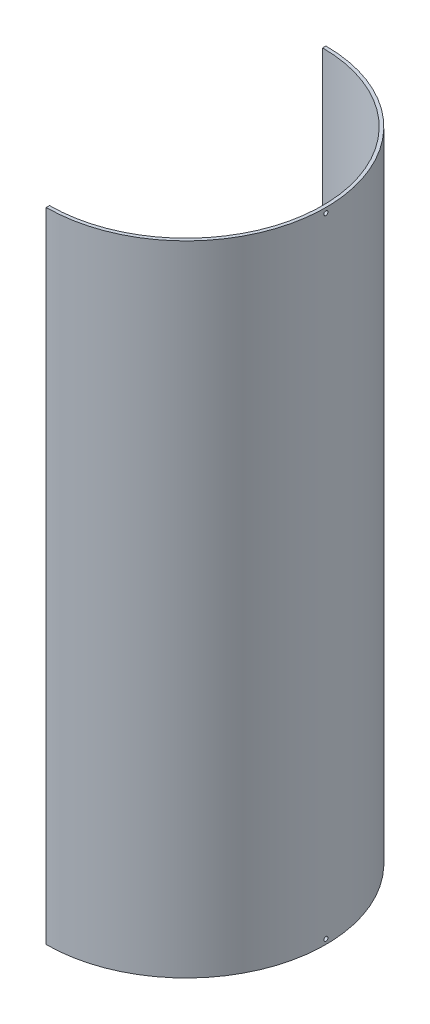
ISO-10303-21;
HEADER;
FILE_DESCRIPTION(('STEP AP214'),'2;1');
FILE_NAME('part.step','',(''),(''),'','','');
FILE_SCHEMA(('AUTOMOTIVE_DESIGN { 1 0 10303 214 1 1 1 1 }'));
ENDSEC;
DATA;
#1=APPLICATION_CONTEXT('core data for automotive mechanical design processes');
#2=APPLICATION_PROTOCOL_DEFINITION('international standard','automotive_design',2000,#1);
#3=PRODUCT_CONTEXT('',#1,'mechanical');
#4=PRODUCT('Part','Part','',(#3));
#5=PRODUCT_RELATED_PRODUCT_CATEGORY('part','',(#4));
#6=PRODUCT_DEFINITION_FORMATION('','',#4);
#7=PRODUCT_DEFINITION_CONTEXT('part definition',#1,'design');
#8=PRODUCT_DEFINITION('design','',#6,#7);
#9=PRODUCT_DEFINITION_SHAPE('','',#8);
#10=(LENGTH_UNIT() NAMED_UNIT(*) SI_UNIT(.MILLI.,.METRE.));
#11=(NAMED_UNIT(*) PLANE_ANGLE_UNIT() SI_UNIT($,.RADIAN.));
#12=(NAMED_UNIT(*) SI_UNIT($,.STERADIAN.) SOLID_ANGLE_UNIT());
#13=UNCERTAINTY_MEASURE_WITH_UNIT(LENGTH_MEASURE(1.E-05),#10,'distance_accuracy_value','');
#14=(GEOMETRIC_REPRESENTATION_CONTEXT(3) GLOBAL_UNCERTAINTY_ASSIGNED_CONTEXT((#13)) GLOBAL_UNIT_ASSIGNED_CONTEXT((#10,
#11,#12)) REPRESENTATION_CONTEXT('',''));
#15=CARTESIAN_POINT('',(0.,0.,0.));
#16=DIRECTION('',(0.,0.,1.));
#17=DIRECTION('',(1.,0.,0.));
#18=AXIS2_PLACEMENT_3D('',#15,#16,#17);
#19=CARTESIAN_POINT('',(0.,388.,0.));
#20=DIRECTION('',(0.,-1.,0.));
#21=DIRECTION('',(0.,0.,-1.));
#22=AXIS2_PLACEMENT_3D('',#19,#20,#21);
#23=CYLINDRICAL_SURFACE('',#22,85.);
#24=CARTESIAN_POINT('',(0.,0.,0.));
#25=DIRECTION('',(0.,1.,0.));
#26=DIRECTION('',(0.,0.,1.));
#27=AXIS2_PLACEMENT_3D('',#24,#25,#26);
#28=CIRCLE('',#27,85.);
#29=CARTESIAN_POINT('',(0.,0.,85.));
#30=VERTEX_POINT('',#29);
#31=CARTESIAN_POINT('',(0.,0.,-85.));
#32=VERTEX_POINT('',#31);
#33=EDGE_CURVE('E110',#30,#32,#28,.T.);
#34=ORIENTED_EDGE('',*,*,#33,.T.);
#35=DIRECTION('',(0.,-1.,0.));
#36=VECTOR('',#35,1.);
#37=CARTESIAN_POINT('',(0.,388.,-85.));
#38=LINE('',#37,#36);
#39=CARTESIAN_POINT('',(0.,388.,-85.));
#40=VERTEX_POINT('',#39);
#41=EDGE_CURVE('E11',#40,#32,#38,.T.);
#42=ORIENTED_EDGE('',*,*,#41,.F.);
#43=CARTESIAN_POINT('',(0.,388.,0.));
#44=DIRECTION('',(0.,1.,0.));
#45=DIRECTION('',(0.,0.,1.));
#46=AXIS2_PLACEMENT_3D('',#43,#44,#45);
#47=CIRCLE('',#46,85.);
#48=CARTESIAN_POINT('',(0.,388.,85.));
#49=VERTEX_POINT('',#48);
#50=EDGE_CURVE('E96',#49,#40,#47,.T.);
#51=ORIENTED_EDGE('',*,*,#50,.F.);
#52=DIRECTION('',(0.,-1.,0.));
#53=VECTOR('',#52,1.);
#54=CARTESIAN_POINT('',(0.,388.,85.));
#55=LINE('',#54,#53);
#56=EDGE_CURVE('E106',#49,#30,#55,.T.);
#57=ORIENTED_EDGE('',*,*,#56,.T.);
#58=EDGE_LOOP('',(#34,#42,#51,#57));
#59=FACE_BOUND('',#58,.T.);
#60=CARTESIAN_POINT('',(84.9908083265478,3.,1.25));
#61=CARTESIAN_POINT('',(84.990808450794,2.92979102439285,1.2499968878209));
#62=CARTESIAN_POINT('',(84.9908962578841,2.85953123728086,1.24406499003692));
#63=CARTESIAN_POINT('',(84.9912380932854,2.72094693363748,1.22048394533192));
#64=CARTESIAN_POINT('',(84.991492321299,2.65262484520824,1.20282072064932));
#65=CARTESIAN_POINT('',(84.9921381929012,2.51994371438623,1.15628021290867));
#66=CARTESIAN_POINT('',(84.9925297704637,2.45558278524422,1.12740831732682));
#67=CARTESIAN_POINT('',(84.9934061332976,2.33263956432474,1.0592775142034));
#68=CARTESIAN_POINT('',(84.9938908954858,2.27405584687664,1.0200211781306));
#69=CARTESIAN_POINT('',(84.9948991342159,2.1642989424529,0.932224768476339));
#70=CARTESIAN_POINT('',(84.9954226174099,2.11312703327363,0.883683097441939));
#71=CARTESIAN_POINT('',(84.9964492362815,2.01965677211857,0.778695825249463));
#72=CARTESIAN_POINT('',(84.9969523711569,1.97735876979085,0.722249912795969));
#73=CARTESIAN_POINT('',(84.9978815632459,1.90283831826771,0.603055944176887));
#74=CARTESIAN_POINT('',(84.9983076184047,1.87061613765004,0.540307720077877));
#75=CARTESIAN_POINT('',(84.9990345987517,1.81716395585418,0.410291619288965));
#76=CARTESIAN_POINT('',(84.9993355242514,1.79593392729815,0.343023753856477));
#77=CARTESIAN_POINT('',(84.9997783013529,1.76507007221177,0.205882895419081));
#78=CARTESIAN_POINT('',(84.9999201643149,1.75543541752608,0.136010088829689));
#79=CARTESIAN_POINT('',(85.0000288609613,1.74803326953307,-0.00436130035869794));
#80=CARTESIAN_POINT('',(84.9999956950531,1.75026574860125,-0.0748598815006226));
#81=CARTESIAN_POINT('',(84.9997580834736,1.76653374400573,-0.214475978896233));
#82=CARTESIAN_POINT('',(84.9995536509936,1.78056835131106,-0.283593601095275));
#83=CARTESIAN_POINT('',(84.9989965674581,1.82004081456977,-0.418491596829382));
#84=CARTESIAN_POINT('',(84.9986439162052,1.84547868570275,-0.48427196592189));
#85=CARTESIAN_POINT('',(84.9978301279874,1.90703661858747,-0.610631017249692));
#86=CARTESIAN_POINT('',(84.9973689867923,1.9431570968802,-0.671209496531701));
#87=CARTESIAN_POINT('',(84.9963902040105,2.02505457307492,-0.785442892301484));
#88=CARTESIAN_POINT('',(84.99587256241,2.07083157331233,-0.839097807114789));
#89=CARTESIAN_POINT('',(84.9948390752576,2.17074780592128,-0.937966322427858));
#90=CARTESIAN_POINT('',(84.9943232298806,2.22488783067189,-0.98317912215736));
#91=CARTESIAN_POINT('',(84.9933515419956,2.33999045180437,-1.06387379750342));
#92=CARTESIAN_POINT('',(84.9928956994959,2.40095304912334,-1.09935567178341));
#93=CARTESIAN_POINT('',(84.9920954153726,2.52797070619439,-1.15958117507117));
#94=CARTESIAN_POINT('',(84.9917509739962,2.59402577724607,-1.18432478025119));
#95=CARTESIAN_POINT('',(84.9912123375409,2.72935308477577,-1.22237084563114));
#96=CARTESIAN_POINT('',(84.9910181423587,2.79862531903903,-1.23567331370723));
#97=CARTESIAN_POINT('',(84.9908019106771,2.93841357563928,-1.25045851246993));
#98=CARTESIAN_POINT('',(84.9907798580491,3.00892948083136,-1.25194235049064));
#99=CARTESIAN_POINT('',(84.9909103557271,3.14920946007819,-1.24305105137799));
#100=CARTESIAN_POINT('',(84.9910629059905,3.21897353431634,-1.2326759171375));
#101=CARTESIAN_POINT('',(84.9915253963844,3.35576638464712,-1.20036210672458));
#102=CARTESIAN_POINT('',(84.9918353296917,3.42279527918698,-1.17842393186452));
#103=CARTESIAN_POINT('',(84.9925776386018,3.55221865351634,-1.12360730837407));
#104=CARTESIAN_POINT('',(84.993010014252,3.61461313151958,-1.09072885552691));
#105=CARTESIAN_POINT('',(84.9939485015186,3.73300159203463,-1.01496213720857));
#106=CARTESIAN_POINT('',(84.9944546186266,3.78899509730358,-0.972073126095725));
#107=CARTESIAN_POINT('',(84.995483510022,3.89298735732856,-0.877503858598246));
#108=CARTESIAN_POINT('',(84.9960062843246,3.94098610472911,-0.8258235941254));
#109=CARTESIAN_POINT('',(84.9970095996239,4.02762998817941,-0.715134120664244));
#110=CARTESIAN_POINT('',(84.9974901373868,4.0662744084563,-0.656124351360505));
#111=CARTESIAN_POINT('',(84.9983547581955,4.13310772323203,-0.532453891251286));
#112=CARTESIAN_POINT('',(84.9987388413708,4.16129663178592,-0.467793208042319));
#113=CARTESIAN_POINT('',(84.9993672370941,4.20641751158421,-0.33465911782744));
#114=CARTESIAN_POINT('',(84.9996115554506,4.2233499506526,-0.26618586940167));
#115=CARTESIAN_POINT('',(84.9999329007717,4.24547878437918,-0.127368036793383));
#116=CARTESIAN_POINT('',(85.0000099275423,4.25067516543754,-0.0570234504424406));
#117=CARTESIAN_POINT('',(84.99998800555,4.24918428089586,0.0835328567390079));
#118=CARTESIAN_POINT('',(84.9998890737044,4.24249815772346,0.153744589692835));
#119=CARTESIAN_POINT('',(84.999526419658,4.21743437887984,0.292048989624351));
#120=CARTESIAN_POINT('',(84.9992626971269,4.19905669976938,0.36014165235344));
#121=CARTESIAN_POINT('',(84.9986001827761,4.151131321253,0.492276241549311));
#122=CARTESIAN_POINT('',(84.9982013884737,4.12158341652049,0.556318093530458));
#123=CARTESIAN_POINT('',(84.9973137007221,4.05215769931719,0.678529897653091));
#124=CARTESIAN_POINT('',(84.9968248107436,4.01228028474209,0.736700075853221));
#125=CARTESIAN_POINT('',(84.9958120262347,3.92332783388822,0.845520266288621));
#126=CARTESIAN_POINT('',(84.9952881320644,3.87425289224117,0.896170355887138));
#127=CARTESIAN_POINT('',(84.9942642542578,3.76828188618908,0.988525773877584));
#128=CARTESIAN_POINT('',(84.9937642765913,3.71138388264879,1.03022887796));
#129=CARTESIAN_POINT('',(84.9928445052435,3.59136902836425,1.10350841994939));
#130=CARTESIAN_POINT('',(84.9924247532574,3.52824896955839,1.13507959780774));
#131=CARTESIAN_POINT('',(84.9917136084664,3.39765306237683,1.18714034164404));
#132=CARTESIAN_POINT('',(84.9914220620558,3.33018253818362,1.20764317557952));
#133=CARTESIAN_POINT('',(84.9910784515362,3.21856910382079,1.23152821711982));
#134=CARTESIAN_POINT('',(84.9909775919348,3.17515125046037,1.23844647374801));
#135=CARTESIAN_POINT('',(84.9908424905773,3.08782889400086,1.24768333855447));
#136=CARTESIAN_POINT('',(84.9908082488165,3.04392439093562,1.25000194705264));
#137=CARTESIAN_POINT('',(84.9908083265478,3.,1.25));
#138=B_SPLINE_CURVE_WITH_KNOTS('',3,(#60,#61,#62,#63,#64,#65,#66,#67,#68,#69,#70,#71,#72,#73,
#74,#75,#76,#77,#78,#79,#80,#81,#82,#83,#84,#85,#86,#87,#88,#89,#90,#91,#92,#93,#94,#95,#96,#97,
#98,#99,#100,#101,#102,#103,#104,#105,#106,#107,#108,#109,#110,#111,#112,#113,#114,#115,#116,
#117,#118,#119,#120,#121,#122,#123,#124,#125,#126,#127,#128,#129,#130,#131,#132,#133,#134,#135,
#136,#137),.UNSPECIFIED.,.T.,.F.,(4,2,2,2,2,2,2,2,2,2,2,2,2,2,2,2,2,2,2,2,2,2,2,2,2,2,2,2,2,2,2,
2,2,2,2,2,2,2,4),(0.,0.21046660151637,0.421186223426564,0.631804687561923,0.842371045603442,
1.05297366220417,1.26358457537305,1.47420110203768,1.68481710412324,1.89541806287156,
2.10601853137955,2.31660278037071,2.52718730968466,2.73778005128744,2.94837284382209,
3.1589856018359,3.36959838877792,3.58021164305827,3.79082475235093,4.00141812823799,
4.21201145275319,4.42259564780496,4.63317992402308,4.84377989072932,5.05438005119475,
5.26499632123822,5.47561230815498,5.68621954122831,5.89682701835485,6.10741424799973,
6.31800189983138,6.5285934227888,6.73917683490626,6.94975808048738,7.16039161814778,
7.37113433120233,7.58162385647475,7.71329673514702,7.84496960466193),.UNSPECIFIED.);
#139=CARTESIAN_POINT('',(84.9908083265478,3.,1.25));
#140=VERTEX_POINT('',#139);
#141=EDGE_CURVE('E124',#140,#140,#138,.T.);
#142=ORIENTED_EDGE('',*,*,#141,.F.);
#143=EDGE_LOOP('',(#142));
#144=FACE_BOUND('',#143,.T.);
#145=CARTESIAN_POINT('',(84.9908083265478,385.,1.25));
#146=CARTESIAN_POINT('',(84.990808450794,384.929791024393,1.2499968878209));
#147=CARTESIAN_POINT('',(84.9908962578841,384.859531237281,1.24406499003692));
#148=CARTESIAN_POINT('',(84.9912380932854,384.720946933637,1.22048394533192));
#149=CARTESIAN_POINT('',(84.991492321299,384.652624845208,1.20282072064932));
#150=CARTESIAN_POINT('',(84.9921381929012,384.519943714386,1.15628021290867));
#151=CARTESIAN_POINT('',(84.9925297704637,384.455582785244,1.12740831732682));
#152=CARTESIAN_POINT('',(84.9934061332976,384.332639564325,1.0592775142034));
#153=CARTESIAN_POINT('',(84.9938908954858,384.274055846877,1.0200211781306));
#154=CARTESIAN_POINT('',(84.9948991342159,384.164298942453,0.932224768476322));
#155=CARTESIAN_POINT('',(84.9954226174099,384.113127033274,0.883683097441915));
#156=CARTESIAN_POINT('',(84.9964492362815,384.019656772119,0.77869582524945));
#157=CARTESIAN_POINT('',(84.9969523711569,383.977358769791,0.722249912795974));
#158=CARTESIAN_POINT('',(84.9978815632459,383.902838318268,0.603055944176907));
#159=CARTESIAN_POINT('',(84.9983076184047,383.87061613765,0.540307720077893));
#160=CARTESIAN_POINT('',(84.9990345987517,383.817163955854,0.410291619288983));
#161=CARTESIAN_POINT('',(84.9993355242514,383.795933927298,0.343023753856499));
#162=CARTESIAN_POINT('',(84.9997783013529,383.765070072212,0.205882895419103));
#163=CARTESIAN_POINT('',(84.9999201643149,383.755435417526,0.136010088829705));
#164=CARTESIAN_POINT('',(85.0000288609613,383.748033269533,-0.00436130035868991));
#165=CARTESIAN_POINT('',(84.9999956950531,383.750265748601,-0.0748598815006176));
#166=CARTESIAN_POINT('',(84.9997580834736,383.766533744006,-0.214475978896225));
#167=CARTESIAN_POINT('',(84.9995536509936,383.780568351311,-0.283593601095261));
#168=CARTESIAN_POINT('',(84.9989965674581,383.82004081457,-0.418491596829371));
#169=CARTESIAN_POINT('',(84.9986439162052,383.845478685703,-0.484271965921886));
#170=CARTESIAN_POINT('',(84.9978301279874,383.907036618587,-0.610631017249678));
#171=CARTESIAN_POINT('',(84.9973689867923,383.94315709688,-0.671209496531673));
#172=CARTESIAN_POINT('',(84.9963902040105,384.025054573075,-0.785442892301453));
#173=CARTESIAN_POINT('',(84.99587256241,384.070831573312,-0.839097807114767));
#174=CARTESIAN_POINT('',(84.9948390752576,384.170747805921,-0.937966322427838));
#175=CARTESIAN_POINT('',(84.9943232298806,384.224887830672,-0.983179122157337));
#176=CARTESIAN_POINT('',(84.9933515419956,384.339990451804,-1.06387379750341));
#177=CARTESIAN_POINT('',(84.9928956994959,384.400953049123,-1.09935567178341));
#178=CARTESIAN_POINT('',(84.9920954153726,384.527970706194,-1.15958117507118));
#179=CARTESIAN_POINT('',(84.9917509739962,384.594025777246,-1.18432478025119));
#180=CARTESIAN_POINT('',(84.9912123375409,384.729353084776,-1.22237084563114));
#181=CARTESIAN_POINT('',(84.9910181423587,384.798625319039,-1.23567331370723));
#182=CARTESIAN_POINT('',(84.9908019106771,384.938413575639,-1.25045851246993));
#183=CARTESIAN_POINT('',(84.9907798580491,385.008929480831,-1.25194235049064));
#184=CARTESIAN_POINT('',(84.9909103557271,385.149209460078,-1.243051051378));
#185=CARTESIAN_POINT('',(84.9910629059905,385.218973534316,-1.23267591713751));
#186=CARTESIAN_POINT('',(84.9915253963844,385.355766384647,-1.20036210672458));
#187=CARTESIAN_POINT('',(84.9918353296917,385.422795279187,-1.17842393186452));
#188=CARTESIAN_POINT('',(84.9925776386018,385.552218653516,-1.12360730837405));
#189=CARTESIAN_POINT('',(84.993010014252,385.61461313152,-1.09072885552689));
#190=CARTESIAN_POINT('',(84.9939485015186,385.733001592035,-1.01496213720854));
#191=CARTESIAN_POINT('',(84.9944546186266,385.788995097304,-0.972073126095698));
#192=CARTESIAN_POINT('',(84.995483510022,385.892987357329,-0.877503858598218));
#193=CARTESIAN_POINT('',(84.9960062843246,385.940986104729,-0.825823594125375));
#194=CARTESIAN_POINT('',(84.9970095996239,386.027629988179,-0.715134120664232));
#195=CARTESIAN_POINT('',(84.9974901373868,386.066274408456,-0.656124351360504));
#196=CARTESIAN_POINT('',(84.9983547581955,386.133107723232,-0.532453891251303));
#197=CARTESIAN_POINT('',(84.9987388413708,386.161296631786,-0.467793208042343));
#198=CARTESIAN_POINT('',(84.9993672370941,386.206417511584,-0.334659117827463));
#199=CARTESIAN_POINT('',(84.9996115554507,386.223349950653,-0.266185869401684));
#200=CARTESIAN_POINT('',(84.9999329007717,386.245478784379,-0.127368036793387));
#201=CARTESIAN_POINT('',(85.0000099275423,386.250675165438,-0.0570234504424437));
#202=CARTESIAN_POINT('',(84.99998800555,386.249184280896,0.0835328567390056));
#203=CARTESIAN_POINT('',(84.9998890737044,386.242498157723,0.153744589692833));
#204=CARTESIAN_POINT('',(84.999526419658,386.21743437888,0.29204898962435));
#205=CARTESIAN_POINT('',(84.9992626971269,386.199056699769,0.36014165235344));
#206=CARTESIAN_POINT('',(84.9986001827761,386.151131321253,0.492276241549306));
#207=CARTESIAN_POINT('',(84.9982013884737,386.121583416521,0.556318093530448));
#208=CARTESIAN_POINT('',(84.9973137007221,386.052157699317,0.678529897653082));
#209=CARTESIAN_POINT('',(84.9968248107436,386.012280284742,0.736700075853217));
#210=CARTESIAN_POINT('',(84.9958120262347,385.923327833888,0.84552026628862));
#211=CARTESIAN_POINT('',(84.9952881320644,385.874252892241,0.896170355887131));
#212=CARTESIAN_POINT('',(84.9942642542578,385.768281886189,0.988525773877585));
#213=CARTESIAN_POINT('',(84.9937642765913,385.711383882649,1.03022887796001));
#214=CARTESIAN_POINT('',(84.9928445052435,385.591369028364,1.10350841994941));
#215=CARTESIAN_POINT('',(84.9924247532574,385.528248969558,1.13507959780775));
#216=CARTESIAN_POINT('',(84.9917136084664,385.397653062377,1.18714034164405));
#217=CARTESIAN_POINT('',(84.9914220620558,385.330182538184,1.20764317557952));
#218=CARTESIAN_POINT('',(84.9910784515362,385.218569103821,1.23152821711983));
#219=CARTESIAN_POINT('',(84.9909775919348,385.17515125046,1.23844647374801));
#220=CARTESIAN_POINT('',(84.9908424905773,385.087828894001,1.24768333855447));
#221=CARTESIAN_POINT('',(84.9908082488165,385.043924390936,1.25000194705265));
#222=CARTESIAN_POINT('',(84.9908083265478,385.,1.25));
#223=B_SPLINE_CURVE_WITH_KNOTS('',3,(#145,#146,#147,#148,#149,#150,#151,#152,#153,#154,#155,
#156,#157,#158,#159,#160,#161,#162,#163,#164,#165,#166,#167,#168,#169,#170,#171,#172,#173,#174,
#175,#176,#177,#178,#179,#180,#181,#182,#183,#184,#185,#186,#187,#188,#189,#190,#191,#192,#193,
#194,#195,#196,#197,#198,#199,#200,#201,#202,#203,#204,#205,#206,#207,#208,#209,#210,#211,#212,
#213,#214,#215,#216,#217,#218,#219,#220,#221,#222),.UNSPECIFIED.,.T.,.F.,(4,2,2,2,2,2,2,2,2,2,2,
2,2,2,2,2,2,2,2,2,2,2,2,2,2,2,2,2,2,2,2,2,2,2,2,2,2,2,4),(0.,0.210466601516387,
0.421186223426557,0.631804687561932,0.842371045603486,1.05297366220418,1.26358457537304,
1.47420110203766,1.68481710412322,1.89541806287155,2.10601853137955,2.31660278037069,
2.52718730968466,2.73778005128738,2.94837284382209,3.15898560183588,3.36959838877792,
3.58021164305828,3.79082475235099,4.001418128238,4.21201145275321,4.42259564780497,
4.63317992402314,4.8437798907294,5.05438005119481,5.26499632123824,5.47561230815497,
5.68621954122831,5.89682701835487,6.10741424799974,6.3180018998314,6.52859342278878,
6.73917683490624,6.9497580804874,7.16039161814781,7.37113433120234,7.58162385647477,
7.71329673514702,7.84496960466195),.UNSPECIFIED.);
#224=CARTESIAN_POINT('',(84.9908083265478,385.,1.25));
#225=VERTEX_POINT('',#224);
#226=EDGE_CURVE('E113',#225,#225,#223,.T.);
#227=ORIENTED_EDGE('',*,*,#226,.F.);
#228=EDGE_LOOP('',(#227));
#229=FACE_BOUND('',#228,.T.);
#230=ADVANCED_FACE('F37',(#59,#144,#229),#23,.T.);
#231=CARTESIAN_POINT('',(0.,388.,0.));
#232=DIRECTION('',(0.,-1.,0.));
#233=DIRECTION('',(0.,0.,-1.));
#234=AXIS2_PLACEMENT_3D('',#231,#232,#233);
#235=CYLINDRICAL_SURFACE('',#234,83.);
#236=CARTESIAN_POINT('',(0.,0.,0.));
#237=DIRECTION('',(0.,-1.,0.));
#238=DIRECTION('',(0.,0.,1.));
#239=AXIS2_PLACEMENT_3D('',#236,#237,#238);
#240=CIRCLE('',#239,83.);
#241=CARTESIAN_POINT('',(0.,0.,-83.));
#242=VERTEX_POINT('',#241);
#243=CARTESIAN_POINT('',(0.,0.,83.));
#244=VERTEX_POINT('',#243);
#245=EDGE_CURVE('E78',#242,#244,#240,.T.);
#246=ORIENTED_EDGE('',*,*,#245,.T.);
#247=DIRECTION('',(0.,-1.,0.));
#248=VECTOR('',#247,1.);
#249=CARTESIAN_POINT('',(0.,388.,83.));
#250=LINE('',#249,#248);
#251=CARTESIAN_POINT('',(0.,388.,83.));
#252=VERTEX_POINT('',#251);
#253=EDGE_CURVE('E101',#252,#244,#250,.T.);
#254=ORIENTED_EDGE('',*,*,#253,.F.);
#255=CARTESIAN_POINT('',(0.,388.,0.));
#256=DIRECTION('',(0.,-1.,0.));
#257=DIRECTION('',(0.,0.,1.));
#258=AXIS2_PLACEMENT_3D('',#255,#256,#257);
#259=CIRCLE('',#258,83.);
#260=CARTESIAN_POINT('',(0.,388.,-83.));
#261=VERTEX_POINT('',#260);
#262=EDGE_CURVE('E94',#261,#252,#259,.T.);
#263=ORIENTED_EDGE('',*,*,#262,.F.);
#264=DIRECTION('',(0.,-1.,0.));
#265=VECTOR('',#264,1.);
#266=CARTESIAN_POINT('',(0.,388.,-83.));
#267=LINE('',#266,#265);
#268=EDGE_CURVE('E52',#261,#242,#267,.T.);
#269=ORIENTED_EDGE('',*,*,#268,.T.);
#270=EDGE_LOOP('',(#246,#254,#263,#269));
#271=FACE_BOUND('',#270,.T.);
#272=CARTESIAN_POINT('',(82.9905868156142,3.,1.25));
#273=CARTESIAN_POINT('',(82.990586942851,3.07020877694062,1.24999688788842));
#274=CARTESIAN_POINT('',(82.9906768657469,3.14046836053018,1.24406502354343));
#275=CARTESIAN_POINT('',(82.9910269378828,3.27905224910748,1.22048411940137));
#276=CARTESIAN_POINT('',(82.9912872916185,3.34737412620949,1.20282100318695));
#277=CARTESIAN_POINT('',(82.991948725404,3.48005483330009,1.1562808005196));
#278=CARTESIAN_POINT('',(82.9923497378177,3.54441555056598,1.1274091030206));
#279=CARTESIAN_POINT('',(82.9932472159121,3.66735838977143,1.05927878449745));
#280=CARTESIAN_POINT('',(82.9937436579585,3.72594193706518,1.02002273436627));
#281=CARTESIAN_POINT('',(82.9947761910387,3.83569875879395,0.932226823731684));
#282=CARTESIAN_POINT('',(82.9953122890152,3.8868707309933,0.883685335217975));
#283=CARTESIAN_POINT('',(82.9963636476546,3.98034116377589,0.77869841712285));
#284=CARTESIAN_POINT('',(82.9968789074956,4.0226392746557,0.722252676194704));
#285=CARTESIAN_POINT('',(82.9978304939808,4.09716007455019,0.603058879292814));
#286=CARTESIAN_POINT('',(82.9982668183463,4.12938247272962,0.540310641466684));
#287=CARTESIAN_POINT('',(82.9990113219292,4.18283507304703,0.410294440048552));
#288=CARTESIAN_POINT('',(82.9993195014689,4.20406530282017,0.343026487819943));
#289=CARTESIAN_POINT('',(82.9997729523033,4.23492946462247,0.205885640316757));
#290=CARTESIAN_POINT('',(82.9999182358147,4.24456426627165,0.13601294079515));
#291=CARTESIAN_POINT('',(83.0000295564867,4.25196673628876,-0.00435826653405077));
#292=CARTESIAN_POINT('',(82.9999955940691,4.24973443258545,-0.0748567728684433));
#293=CARTESIAN_POINT('',(82.9997522629271,4.23346684530727,-0.214472474708405));
#294=CARTESIAN_POINT('',(82.999542908374,4.21943251530947,-0.283589781349901));
#295=CARTESIAN_POINT('',(82.9989724100565,4.17996072520165,-0.418487192627727));
#296=CARTESIAN_POINT('',(82.998611266088,4.15452324975918,-0.48426729277678));
#297=CARTESIAN_POINT('',(82.9977778773687,4.09296616412025,-0.610626005452963));
#298=CARTESIAN_POINT('',(82.9973056280729,4.05684611691756,-0.67120440505634));
#299=CARTESIAN_POINT('',(82.9963032660063,3.97494956128755,-0.785437734258269));
#300=CARTESIAN_POINT('',(82.9957731532198,3.92917305022031,-0.839092661964043));
#301=CARTESIAN_POINT('',(82.9947147619368,3.82925758832059,-0.937961554847767));
#302=CARTESIAN_POINT('',(82.9941864836279,3.77511780651831,-0.983174680266031));
#303=CARTESIAN_POINT('',(82.9931913734805,3.66001559265982,-1.06387004971996));
#304=CARTESIAN_POINT('',(82.9927245416503,3.59905315966412,-1.09935229241567));
#305=CARTESIAN_POINT('',(82.9919049618094,3.47203572589982,-1.15957856071406));
#306=CARTESIAN_POINT('',(82.9915522140647,3.40598071325642,-1.18432256127658));
#307=CARTESIAN_POINT('',(82.9910005852092,3.2706534247893,-1.22236940971413));
#308=CARTESIAN_POINT('',(82.9908017039876,3.20138115128141,-1.23567226582453));
#309=CARTESIAN_POINT('',(82.9905802502382,3.06159305828319,-1.25045817426729));
#310=CARTESIAN_POINT('',(82.9905576603873,2.9910773616584,-1.25194238794052));
#311=CARTESIAN_POINT('',(82.9906912910886,2.85079773740901,-1.24305190377742));
#312=CARTESIAN_POINT('',(82.9908475115946,2.78103380959043,-1.23267720900114));
#313=CARTESIAN_POINT('',(82.9913211350973,2.64424133569549,-1.2003643733364));
#314=CARTESIAN_POINT('',(82.9916385307646,2.57721266538564,-1.17842675825898));
#315=CARTESIAN_POINT('',(82.9923987153318,2.44778963864692,-1.12361135890116));
#316=CARTESIAN_POINT('',(82.9928415042831,2.38539528412084,-1.09073357012887));
#317=CARTESIAN_POINT('',(82.9938025980845,2.26700671687581,-1.01496812600768));
#318=CARTESIAN_POINT('',(82.9943209088332,2.21101300470243,-0.972079688598757));
#319=CARTESIAN_POINT('',(82.9953745913631,2.10702021684982,-0.877511551702221));
#320=CARTESIAN_POINT('',(82.9959099631605,2.05902114872698,-0.825831843905339));
#321=CARTESIAN_POINT('',(82.9969374606137,1.97237633849377,-0.71514321971839));
#322=CARTESIAN_POINT('',(82.9974295827974,1.93373134692842,-0.656133715780346));
#323=CARTESIAN_POINT('',(82.9983150503022,1.86689685742488,-0.532463652765377));
#324=CARTESIAN_POINT('',(82.9987083957575,1.83870734528466,-0.467803101364607));
#325=CARTESIAN_POINT('',(82.9993519486189,1.79358530478541,-0.334669268936935));
#326=CARTESIAN_POINT('',(82.9996021622606,1.77665228602159,-0.266196154150537));
#327=CARTESIAN_POINT('',(82.9999312678498,1.75452228188289,-0.127378471350555));
#328=CARTESIAN_POINT('',(83.0000101596042,1.74932530973965,-0.0570339012271159));
#329=CARTESIAN_POINT('',(82.9999877270611,1.75081501961857,0.083522146687853));
#330=CARTESIAN_POINT('',(82.9998864209169,1.75750050459843,0.153733637172566));
#331=CARTESIAN_POINT('',(82.999515047748,1.78256292005008,0.292037655362025));
#332=CARTESIAN_POINT('',(82.9992449803851,1.80093987395719,0.360130178819055));
#333=CARTESIAN_POINT('',(82.9985665206426,1.84886372348694,0.49226460613457));
#334=CARTESIAN_POINT('',(82.9981581257225,1.87841082426263,0.55630643557202));
#335=CARTESIAN_POINT('',(82.9972490630542,1.94783487373747,0.678518343313696));
#336=CARTESIAN_POINT('',(82.9967483988571,1.98771142491913,0.736688647457395));
#337=CARTESIAN_POINT('',(82.9957112158967,2.07666233126373,0.845509520991641));
#338=CARTESIAN_POINT('',(82.9951746973374,2.12573663410481,0.896160133155396));
#339=CARTESIAN_POINT('',(82.9941261422013,2.23170645818097,0.988516710450252));
#340=CARTESIAN_POINT('',(82.9936141117369,2.28860391848917,1.03022045139902));
#341=CARTESIAN_POINT('',(82.9926721618068,2.40861794177913,1.10350144292052));
#342=CARTESIAN_POINT('',(82.9922422852032,2.47173772524287,1.13507341324914));
#343=CARTESIAN_POINT('',(82.9915139819254,2.60233325986135,1.18713576753142));
#344=CARTESIAN_POINT('',(82.9912153979565,2.66980368695685,1.20763941858841));
#345=CARTESIAN_POINT('',(82.9908634804923,2.78141929887996,1.23152624245409));
#346=CARTESIAN_POINT('',(82.9907601790632,2.82483942172094,1.2384452378248));
#347=CARTESIAN_POINT('',(82.9906218068232,2.91216640032732,1.24768308999005));
#348=CARTESIAN_POINT('',(82.9905867360073,2.9560732560572,1.25000194712021));
#349=CARTESIAN_POINT('',(82.9905868156142,3.,1.25));
#350=B_SPLINE_CURVE_WITH_KNOTS('',3,(#272,#273,#274,#275,#276,#277,#278,#279,#280,#281,#282,
#283,#284,#285,#286,#287,#288,#289,#290,#291,#292,#293,#294,#295,#296,#297,#298,#299,#300,#301,
#302,#303,#304,#305,#306,#307,#308,#309,#310,#311,#312,#313,#314,#315,#316,#317,#318,#319,#320,
#321,#322,#323,#324,#325,#326,#327,#328,#329,#330,#331,#332,#333,#334,#335,#336,#337,#338,#339,
#340,#341,#342,#343,#344,#345,#346,#347,#348,#349),.UNSPECIFIED.,.T.,.F.,(4,2,2,2,2,2,2,2,2,2,2,
2,2,2,2,2,2,2,2,2,2,2,2,2,2,2,2,2,2,2,2,2,2,2,2,2,2,2,4),(0.,0.210465996859848,
0.421184990803921,0.631802798754601,0.842368511989971,1.05297117747923,1.26358214089495,
1.47419918303084,1.68481569565659,1.89541641173304,2.10601663216934,2.31659983821825,
2.52718332741413,2.73777543242195,2.94836759500253,3.15898069537477,3.36959382474882,
3.58020744524245,3.79082091413595,4.00141368716302,4.21200640584905,4.42258954888961,
4.63317277839284,4.84377246475977,5.05437235018104,5.26498912795276,5.47560561963561,
5.68621293491649,5.89682048764333,6.10740682490458,6.31799358428338,6.52858421152658,
6.73916673562591,6.94974806185232,7.16038167785708,7.37112488946233,7.58161492843441,
7.71329485550491,7.84497477296805),.UNSPECIFIED.);
#351=CARTESIAN_POINT('',(82.9905868156142,3.,1.25));
#352=VERTEX_POINT('',#351);
#353=EDGE_CURVE('E118',#352,#352,#350,.T.);
#354=ORIENTED_EDGE('',*,*,#353,.F.);
#355=EDGE_LOOP('',(#354));
#356=FACE_BOUND('',#355,.T.);
#357=CARTESIAN_POINT('',(82.9905868156142,385.,1.25));
#358=CARTESIAN_POINT('',(82.990586942851,385.070208776941,1.24999688788843));
#359=CARTESIAN_POINT('',(82.9906768657469,385.14046836053,1.24406502354343));
#360=CARTESIAN_POINT('',(82.9910269378828,385.279052249108,1.22048411940137));
#361=CARTESIAN_POINT('',(82.9912872916185,385.34737412621,1.20282100318694));
#362=CARTESIAN_POINT('',(82.991948725404,385.4800548333,1.15628080051959));
#363=CARTESIAN_POINT('',(82.9923497378177,385.544415550566,1.12740910302058));
#364=CARTESIAN_POINT('',(82.9932472159121,385.667358389771,1.05927878449742));
#365=CARTESIAN_POINT('',(82.9937436579585,385.725941937065,1.02002273436624));
#366=CARTESIAN_POINT('',(82.9947761910387,385.835698758794,0.932226823731653));
#367=CARTESIAN_POINT('',(82.9953122890152,385.886870730993,0.883685335217934));
#368=CARTESIAN_POINT('',(82.9963636476546,385.980341163776,0.778698417122809));
#369=CARTESIAN_POINT('',(82.9968789074956,386.022639274656,0.722252676194671));
#370=CARTESIAN_POINT('',(82.9978304939808,386.09716007455,0.603058879292779));
#371=CARTESIAN_POINT('',(82.9982668183463,386.12938247273,0.540310641466637));
#372=CARTESIAN_POINT('',(82.9990113219292,386.182835073047,0.410294440048505));
#373=CARTESIAN_POINT('',(82.9993195014689,386.20406530282,0.343026487819906));
#374=CARTESIAN_POINT('',(82.9997729523033,386.234929464622,0.205885640316724));
#375=CARTESIAN_POINT('',(82.9999182358147,386.244564266272,0.136012940795111));
#376=CARTESIAN_POINT('',(83.0000295564867,386.251966736289,-0.00435826653410067));
#377=CARTESIAN_POINT('',(82.9999955940691,386.249734432585,-0.0748567728684971));
#378=CARTESIAN_POINT('',(82.9997522629271,386.233466845307,-0.21447247470846));
#379=CARTESIAN_POINT('',(82.999542908374,386.219432515309,-0.283589781349954));
#380=CARTESIAN_POINT('',(82.9989724100565,386.179960725202,-0.418487192627776));
#381=CARTESIAN_POINT('',(82.998611266088,386.154523249759,-0.484267292776827));
#382=CARTESIAN_POINT('',(82.9977778773687,386.09296616412,-0.610626005453004));
#383=CARTESIAN_POINT('',(82.9973056280729,386.056846116918,-0.671204405056375));
#384=CARTESIAN_POINT('',(82.9963032660063,385.974949561288,-0.785437734258298));
#385=CARTESIAN_POINT('',(82.9957731532198,385.92917305022,-0.839092661964071));
#386=CARTESIAN_POINT('',(82.9947147619368,385.829257588321,-0.9379615548478));
#387=CARTESIAN_POINT('',(82.9941864836279,385.775117806518,-0.983174680266067));
#388=CARTESIAN_POINT('',(82.9931913734805,385.66001559266,-1.06387004971999));
#389=CARTESIAN_POINT('',(82.9927245416503,385.599053159664,-1.09935229241569));
#390=CARTESIAN_POINT('',(82.9919049618094,385.4720357259,-1.15957856071409));
#391=CARTESIAN_POINT('',(82.9915522140647,385.405980713256,-1.18432256127661));
#392=CARTESIAN_POINT('',(82.9910005852092,385.270653424789,-1.22236940971416));
#393=CARTESIAN_POINT('',(82.9908017039876,385.201381151281,-1.23567226582454));
#394=CARTESIAN_POINT('',(82.9905802502382,385.061593058283,-1.25045817426729));
#395=CARTESIAN_POINT('',(82.9905576603873,384.991077361658,-1.25194238794052));
#396=CARTESIAN_POINT('',(82.9906912910886,384.850797737409,-1.24305190377741));
#397=CARTESIAN_POINT('',(82.9908475115946,384.78103380959,-1.23267720900114));
#398=CARTESIAN_POINT('',(82.9913211350973,384.644241335696,-1.2003643733364));
#399=CARTESIAN_POINT('',(82.9916385307646,384.577212665386,-1.17842675825897));
#400=CARTESIAN_POINT('',(82.9923987153318,384.447789638647,-1.12361135890113));
#401=CARTESIAN_POINT('',(82.9928415042831,384.385395284121,-1.09073357012884));
#402=CARTESIAN_POINT('',(82.9938025980845,384.267006716876,-1.01496812600764));
#403=CARTESIAN_POINT('',(82.9943209088332,384.211013004702,-0.972079688598711));
#404=CARTESIAN_POINT('',(82.9953745913631,384.10702021685,-0.877511551702186));
#405=CARTESIAN_POINT('',(82.9959099631605,384.059021148727,-0.825831843905313));
#406=CARTESIAN_POINT('',(82.9969374606137,383.972376338494,-0.715143219718375));
#407=CARTESIAN_POINT('',(82.9974295827974,383.933731346928,-0.656133715780333));
#408=CARTESIAN_POINT('',(82.9983150503022,383.866896857425,-0.532463652765354));
#409=CARTESIAN_POINT('',(82.9987083957575,383.838707345285,-0.467803101364571));
#410=CARTESIAN_POINT('',(82.9993519486189,383.793585304785,-0.334669268936885));
#411=CARTESIAN_POINT('',(82.9996021622606,383.776652286022,-0.266196154150486));
#412=CARTESIAN_POINT('',(82.9999312678498,383.754522281883,-0.127378471350501));
#413=CARTESIAN_POINT('',(83.0000101596042,383.74932530974,-0.0570339012270607));
#414=CARTESIAN_POINT('',(82.9999877270611,383.750815019619,0.0835221466879046));
#415=CARTESIAN_POINT('',(82.9998864209169,383.757500504598,0.153733637172613));
#416=CARTESIAN_POINT('',(82.999515047748,383.78256292005,0.292037655362067));
#417=CARTESIAN_POINT('',(82.9992449803851,383.800939873957,0.360130178819098));
#418=CARTESIAN_POINT('',(82.9985665206426,383.848863723487,0.492264606134611));
#419=CARTESIAN_POINT('',(82.9981581257225,383.878410824263,0.556306435572058));
#420=CARTESIAN_POINT('',(82.9972490630542,383.947834873737,0.678518343313735));
#421=CARTESIAN_POINT('',(82.9967483988571,383.987711424919,0.736688647457437));
#422=CARTESIAN_POINT('',(82.9957112158967,384.076662331264,0.84550952099168));
#423=CARTESIAN_POINT('',(82.9951746973374,384.125736634105,0.896160133155431));
#424=CARTESIAN_POINT('',(82.9941261422013,384.231706458181,0.988516710450279));
#425=CARTESIAN_POINT('',(82.9936141117369,384.288603918489,1.03022045139904));
#426=CARTESIAN_POINT('',(82.9926721618068,384.408617941779,1.10350144292053));
#427=CARTESIAN_POINT('',(82.9922422852032,384.471737725243,1.13507341324915));
#428=CARTESIAN_POINT('',(82.9915139819254,384.602333259861,1.18713576753143));
#429=CARTESIAN_POINT('',(82.9912153979565,384.669803686957,1.20763941858841));
#430=CARTESIAN_POINT('',(82.9908634804923,384.78141929888,1.23152624245409));
#431=CARTESIAN_POINT('',(82.9907601790632,384.824839421721,1.23844523782481));
#432=CARTESIAN_POINT('',(82.9906218068232,384.912166400327,1.24768308999005));
#433=CARTESIAN_POINT('',(82.9905867360073,384.956073256057,1.25000194712021));
#434=CARTESIAN_POINT('',(82.9905868156142,385.,1.25));
#435=B_SPLINE_CURVE_WITH_KNOTS('',3,(#357,#358,#359,#360,#361,#362,#363,#364,#365,#366,#367,
#368,#369,#370,#371,#372,#373,#374,#375,#376,#377,#378,#379,#380,#381,#382,#383,#384,#385,#386,
#387,#388,#389,#390,#391,#392,#393,#394,#395,#396,#397,#398,#399,#400,#401,#402,#403,#404,#405,
#406,#407,#408,#409,#410,#411,#412,#413,#414,#415,#416,#417,#418,#419,#420,#421,#422,#423,#424,
#425,#426,#427,#428,#429,#430,#431,#432,#433,#434),.UNSPECIFIED.,.T.,.F.,(4,2,2,2,2,2,2,2,2,2,2,
2,2,2,2,2,2,2,2,2,2,2,2,2,2,2,2,2,2,2,2,2,2,2,2,2,2,2,4),(0.,0.210465996859854,
0.421184990803956,0.631802798754669,0.842368511990042,1.05297117747929,1.26358214089501,
1.47419918303089,1.68481569565663,1.89541641173309,2.1060166321694,2.31659983821831,
2.52718332741418,2.737775432422,2.94836759500256,3.15898069537481,3.36959382474891,
3.58020744524257,3.79082091413605,4.00141368716307,4.21200640584905,4.42258954888965,
4.63317277839296,4.84377246475984,5.05437235018109,5.26498912795279,5.47560561963566,
5.68621293491655,5.8968204876434,6.10740682490464,6.31799358428344,6.52858421152662,
6.73916673562597,6.9497480618524,7.16038167785715,7.37112488946234,7.58161492843439,
7.71329485550498,7.84497477296807),.UNSPECIFIED.);
#436=CARTESIAN_POINT('',(82.9905868156142,385.,1.25));
#437=VERTEX_POINT('',#436);
#438=EDGE_CURVE('E41',#437,#437,#435,.T.);
#439=ORIENTED_EDGE('',*,*,#438,.F.);
#440=EDGE_LOOP('',(#439));
#441=FACE_BOUND('',#440,.T.);
#442=ADVANCED_FACE('F103',(#271,#356,#441),#235,.F.);
#443=CARTESIAN_POINT('',(0.,388.,-85.));
#444=DIRECTION('',(1.,0.,0.));
#445=DIRECTION('',(0.,0.,-1.));
#446=AXIS2_PLACEMENT_3D('',#443,#444,#445);
#447=PLANE('',#446);
#448=DIRECTION('',(0.,0.,1.));
#449=VECTOR('',#448,1.);
#450=CARTESIAN_POINT('',(0.,0.,-85.));
#451=LINE('',#450,#449);
#452=EDGE_CURVE('E100',#32,#242,#451,.T.);
#453=ORIENTED_EDGE('',*,*,#452,.T.);
#454=ORIENTED_EDGE('',*,*,#268,.F.);
#455=DIRECTION('',(0.,0.,1.));
#456=VECTOR('',#455,1.);
#457=CARTESIAN_POINT('',(0.,388.,-85.));
#458=LINE('',#457,#456);
#459=EDGE_CURVE('E91',#40,#261,#458,.T.);
#460=ORIENTED_EDGE('',*,*,#459,.F.);
#461=ORIENTED_EDGE('',*,*,#41,.T.);
#462=EDGE_LOOP('',(#453,#454,#460,#461));
#463=FACE_BOUND('',#462,.T.);
#464=ADVANCED_FACE('F99',(#463),#447,.F.);
#465=CARTESIAN_POINT('',(0.,388.,83.));
#466=DIRECTION('',(1.,0.,0.));
#467=DIRECTION('',(0.,0.,-1.));
#468=AXIS2_PLACEMENT_3D('',#465,#466,#467);
#469=PLANE('',#468);
#470=DIRECTION('',(0.,0.,1.));
#471=VECTOR('',#470,1.);
#472=CARTESIAN_POINT('',(0.,0.,83.));
#473=LINE('',#472,#471);
#474=EDGE_CURVE('E84',#244,#30,#473,.T.);
#475=ORIENTED_EDGE('',*,*,#474,.T.);
#476=ORIENTED_EDGE('',*,*,#56,.F.);
#477=DIRECTION('',(0.,0.,1.));
#478=VECTOR('',#477,1.);
#479=CARTESIAN_POINT('',(0.,388.,83.));
#480=LINE('',#479,#478);
#481=EDGE_CURVE('E61',#252,#49,#480,.T.);
#482=ORIENTED_EDGE('',*,*,#481,.F.);
#483=ORIENTED_EDGE('',*,*,#253,.T.);
#484=EDGE_LOOP('',(#475,#476,#482,#483));
#485=FACE_BOUND('',#484,.T.);
#486=ADVANCED_FACE('F158',(#485),#469,.F.);
#487=CARTESIAN_POINT('',(0.,388.,0.));
#488=DIRECTION('',(0.,1.,0.));
#489=DIRECTION('',(0.,0.,1.));
#490=AXIS2_PLACEMENT_3D('',#487,#488,#489);
#491=PLANE('',#490);
#492=ORIENTED_EDGE('',*,*,#50,.T.);
#493=ORIENTED_EDGE('',*,*,#459,.T.);
#494=ORIENTED_EDGE('',*,*,#262,.T.);
#495=ORIENTED_EDGE('',*,*,#481,.T.);
#496=EDGE_LOOP('',(#492,#493,#494,#495));
#497=FACE_BOUND('',#496,.T.);
#498=ADVANCED_FACE('F92',(#497),#491,.T.);
#499=CARTESIAN_POINT('',(0.,0.,0.));
#500=DIRECTION('',(0.,1.,0.));
#501=DIRECTION('',(0.,0.,1.));
#502=AXIS2_PLACEMENT_3D('',#499,#500,#501);
#503=PLANE('',#502);
#504=ORIENTED_EDGE('',*,*,#33,.F.);
#505=ORIENTED_EDGE('',*,*,#474,.F.);
#506=ORIENTED_EDGE('',*,*,#245,.F.);
#507=ORIENTED_EDGE('',*,*,#452,.F.);
#508=EDGE_LOOP('',(#504,#505,#506,#507));
#509=FACE_BOUND('',#508,.T.);
#510=ADVANCED_FACE('F132',(#509),#503,.F.);
#511=CARTESIAN_POINT('',(202.,3.,0.));
#512=DIRECTION('',(-1.,0.,0.));
#513=DIRECTION('',(0.,0.,1.));
#514=AXIS2_PLACEMENT_3D('',#511,#512,#513);
#515=CYLINDRICAL_SURFACE('',#514,1.25);
#516=ORIENTED_EDGE('',*,*,#353,.T.);
#517=EDGE_LOOP('',(#516));
#518=FACE_BOUND('',#517,.T.);
#519=ORIENTED_EDGE('',*,*,#141,.T.);
#520=EDGE_LOOP('',(#519));
#521=FACE_BOUND('',#520,.T.);
#522=ADVANCED_FACE('F127',(#518,#521),#515,.F.);
#523=CARTESIAN_POINT('',(202.,385.,0.));
#524=DIRECTION('',(-1.,0.,0.));
#525=DIRECTION('',(0.,0.,1.));
#526=AXIS2_PLACEMENT_3D('',#523,#524,#525);
#527=CYLINDRICAL_SURFACE('',#526,1.25);
#528=ORIENTED_EDGE('',*,*,#438,.T.);
#529=EDGE_LOOP('',(#528));
#530=FACE_BOUND('',#529,.T.);
#531=ORIENTED_EDGE('',*,*,#226,.T.);
#532=EDGE_LOOP('',(#531));
#533=FACE_BOUND('',#532,.T.);
#534=ADVANCED_FACE('F131',(#530,#533),#527,.F.);
#535=CLOSED_SHELL('',(#230,#442,#464,#486,#498,#510,#522,#534));
#536=MANIFOLD_SOLID_BREP('B2',#535);
#537=ADVANCED_BREP_SHAPE_REPRESENTATION('',(#18,#536),#14);
#538=SHAPE_DEFINITION_REPRESENTATION(#9,#537);
ENDSEC;
END-ISO-10303-21;
